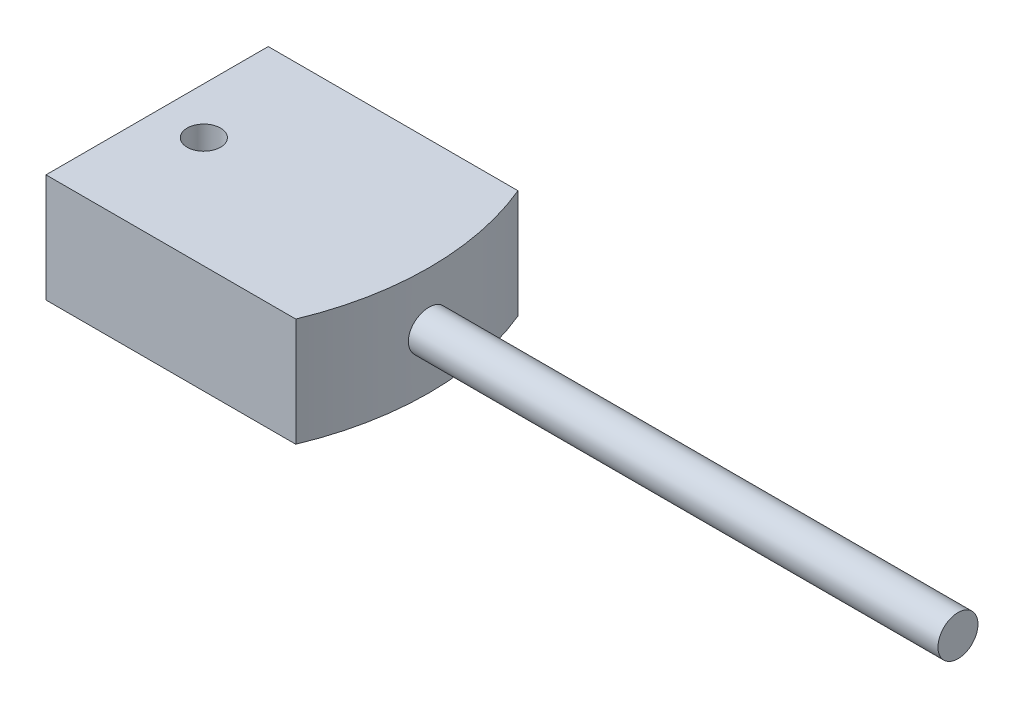
ISO-10303-21;
HEADER;
FILE_DESCRIPTION(('STEP AP214'),'2;1');
FILE_NAME('part.step','',(''),(''),'','','');
FILE_SCHEMA(('AUTOMOTIVE_DESIGN { 1 0 10303 214 1 1 1 1 }'));
ENDSEC;
DATA;
#1=APPLICATION_CONTEXT('core data for automotive mechanical design processes');
#2=APPLICATION_PROTOCOL_DEFINITION('international standard','automotive_design',2000,#1);
#3=PRODUCT_CONTEXT('',#1,'mechanical');
#4=PRODUCT('Part','Part','',(#3));
#5=PRODUCT_RELATED_PRODUCT_CATEGORY('part','',(#4));
#6=PRODUCT_DEFINITION_FORMATION('','',#4);
#7=PRODUCT_DEFINITION_CONTEXT('part definition',#1,'design');
#8=PRODUCT_DEFINITION('design','',#6,#7);
#9=PRODUCT_DEFINITION_SHAPE('','',#8);
#10=(LENGTH_UNIT() NAMED_UNIT(*) SI_UNIT(.MILLI.,.METRE.));
#11=(NAMED_UNIT(*) PLANE_ANGLE_UNIT() SI_UNIT($,.RADIAN.));
#12=(NAMED_UNIT(*) SI_UNIT($,.STERADIAN.) SOLID_ANGLE_UNIT());
#13=UNCERTAINTY_MEASURE_WITH_UNIT(LENGTH_MEASURE(1.E-05),#10,'distance_accuracy_value','');
#14=(GEOMETRIC_REPRESENTATION_CONTEXT(3) GLOBAL_UNCERTAINTY_ASSIGNED_CONTEXT((#13)) GLOBAL_UNIT_ASSIGNED_CONTEXT((#10,
#11,#12)) REPRESENTATION_CONTEXT('',''));
#15=CARTESIAN_POINT('',(0.,0.,0.));
#16=DIRECTION('',(0.,0.,1.));
#17=DIRECTION('',(1.,0.,0.));
#18=AXIS2_PLACEMENT_3D('',#15,#16,#17);
#19=CARTESIAN_POINT('',(0.,-4.1275,-8.4582));
#20=DIRECTION('',(-1.,0.,0.));
#21=DIRECTION('',(0.,0.,1.));
#22=AXIS2_PLACEMENT_3D('',#19,#20,#21);
#23=PLANE('',#22);
#24=DIRECTION('',(0.,1.,0.));
#25=VECTOR('',#24,1.);
#26=CARTESIAN_POINT('',(0.,-4.1275,8.4582));
#27=LINE('',#26,#25);
#28=CARTESIAN_POINT('',(0.,-4.1275,8.4582));
#29=VERTEX_POINT('',#28);
#30=CARTESIAN_POINT('',(0.,4.1275,8.4582));
#31=VERTEX_POINT('',#30);
#32=EDGE_CURVE('E77',#29,#31,#27,.T.);
#33=ORIENTED_EDGE('',*,*,#32,.T.);
#34=DIRECTION('',(0.,0.,1.));
#35=VECTOR('',#34,1.);
#36=CARTESIAN_POINT('',(0.,4.1275,-8.4582));
#37=LINE('',#36,#35);
#38=CARTESIAN_POINT('',(0.,4.1275,-8.4582));
#39=VERTEX_POINT('',#38);
#40=EDGE_CURVE('E80',#39,#31,#37,.T.);
#41=ORIENTED_EDGE('',*,*,#40,.F.);
#42=DIRECTION('',(0.,1.,0.));
#43=VECTOR('',#42,1.);
#44=CARTESIAN_POINT('',(0.,-4.1275,-8.4582));
#45=LINE('',#44,#43);
#46=CARTESIAN_POINT('',(0.,-4.1275,-8.4582));
#47=VERTEX_POINT('',#46);
#48=EDGE_CURVE('E46',#47,#39,#45,.T.);
#49=ORIENTED_EDGE('',*,*,#48,.F.);
#50=DIRECTION('',(0.,0.,1.));
#51=VECTOR('',#50,1.);
#52=CARTESIAN_POINT('',(0.,-4.1275,-8.4582));
#53=LINE('',#52,#51);
#54=EDGE_CURVE('E81',#47,#29,#53,.T.);
#55=ORIENTED_EDGE('',*,*,#54,.T.);
#56=EDGE_LOOP('',(#33,#41,#49,#55));
#57=FACE_BOUND('',#56,.T.);
#58=ADVANCED_FACE('F34',(#57),#23,.T.);
#59=CARTESIAN_POINT('',(0.,-4.1275,-8.4582));
#60=DIRECTION('',(0.,0.,-1.));
#61=DIRECTION('',(-1.,0.,0.));
#62=AXIS2_PLACEMENT_3D('',#59,#60,#61);
#63=PLANE('',#62);
#64=ORIENTED_EDGE('',*,*,#48,.T.);
#65=DIRECTION('',(-1.,0.,0.));
#66=VECTOR('',#65,1.);
#67=CARTESIAN_POINT('',(0.,4.1275,-8.4582));
#68=LINE('',#67,#66);
#69=CARTESIAN_POINT('',(19.0109115872841,4.1275,-8.4582));
#70=VERTEX_POINT('',#69);
#71=EDGE_CURVE('E98',#70,#39,#68,.T.);
#72=ORIENTED_EDGE('',*,*,#71,.F.);
#73=DIRECTION('',(0.,1.,0.));
#74=VECTOR('',#73,1.);
#75=CARTESIAN_POINT('',(19.0109115872841,-4.1275,-8.4582));
#76=LINE('',#75,#74);
#77=CARTESIAN_POINT('',(19.0109115872841,-4.1275,-8.4582));
#78=VERTEX_POINT('',#77);
#79=EDGE_CURVE('E60',#78,#70,#76,.T.);
#80=ORIENTED_EDGE('',*,*,#79,.F.);
#81=DIRECTION('',(-1.,0.,0.));
#82=VECTOR('',#81,1.);
#83=CARTESIAN_POINT('',(0.,-4.1275,-8.4582));
#84=LINE('',#83,#82);
#85=EDGE_CURVE('E86',#78,#47,#84,.T.);
#86=ORIENTED_EDGE('',*,*,#85,.T.);
#87=EDGE_LOOP('',(#64,#72,#80,#86));
#88=FACE_BOUND('',#87,.T.);
#89=ADVANCED_FACE('F123',(#88),#63,.T.);
#90=CARTESIAN_POINT('',(-1.30895685286196,-4.1275,0.));
#91=DIRECTION('',(0.,1.,0.));
#92=DIRECTION('',(0.,0.,1.));
#93=AXIS2_PLACEMENT_3D('',#90,#91,#92);
#94=CYLINDRICAL_SURFACE('',#93,22.009956852862);
#95=CARTESIAN_POINT('',(20.6481746689203,0.,-1.524));
#96=CARTESIAN_POINT('',(20.6481753736805,0.0854935892102639,-1.5239962456546));
#97=CARTESIAN_POINT('',(20.6486793646845,0.171046556361679,-1.51678176767352));
#98=CARTESIAN_POINT('',(20.6506410342152,0.33978875627285,-1.48810613556567));
#99=CARTESIAN_POINT('',(20.6520998141593,0.422975143227746,-1.46662852747539));
#100=CARTESIAN_POINT('',(20.6558050409871,0.584515593065406,-1.41004775284132));
#101=CARTESIAN_POINT('',(20.6580510630406,0.662872235525447,-1.37495193418645));
#102=CARTESIAN_POINT('',(20.6630771650274,0.812562410684095,-1.29214322807104));
#103=CARTESIAN_POINT('',(20.6658571250107,0.883897515349698,-1.24443317351575));
#104=CARTESIAN_POINT('',(20.6716435564557,1.01766903030627,-1.13765597046794));
#105=CARTESIAN_POINT('',(20.6746503839617,1.08009098892454,-1.07857073453173));
#106=CARTESIAN_POINT('',(20.6805484589532,1.19414043067057,-0.950758083120181));
#107=CARTESIAN_POINT('',(20.6834397015478,1.24576745739163,-0.882030260164154));
#108=CARTESIAN_POINT('',(20.6887840171801,1.33680722310857,-0.736800190016863));
#109=CARTESIAN_POINT('',(20.6912366535609,1.37620781837619,-0.660290312895642));
#110=CARTESIAN_POINT('',(20.6954236241466,1.4415985628889,-0.501721390017478));
#111=CARTESIAN_POINT('',(20.6971579674652,1.46758888228434,-0.419662414682756));
#112=CARTESIAN_POINT('',(20.6997104661758,1.50538069464529,-0.25246548531031));
#113=CARTESIAN_POINT('',(20.700530099766,1.51720508246092,-0.167332729157553));
#114=CARTESIAN_POINT('',(20.7011658156926,1.52640010577661,0.00371287052735174));
#115=CARTESIAN_POINT('',(20.7009819114929,1.52377093519153,0.0896257035782292));
#116=CARTESIAN_POINT('',(20.6996325025182,1.50415230959234,0.259637584880649));
#117=CARTESIAN_POINT('',(20.6984686809923,1.48718747941912,0.343739489944466));
#118=CARTESIAN_POINT('',(20.6952923647496,1.43941733990774,0.507899066894549));
#119=CARTESIAN_POINT('',(20.693279864109,1.40861193396078,0.587956710547069));
#120=CARTESIAN_POINT('',(20.6886298292125,1.33400733912662,0.741834073149012));
#121=CARTESIAN_POINT('',(20.6859917603912,1.29019702908102,0.815648383402729));
#122=CARTESIAN_POINT('',(20.6803873580139,1.19083432414051,0.954884707035817));
#123=CARTESIAN_POINT('',(20.6774210198963,1.13528176607007,1.02030660377015));
#124=CARTESIAN_POINT('',(20.6714864326967,1.01387250644691,1.14104481249369));
#125=CARTESIAN_POINT('',(20.6685181926693,0.947994424507888,1.19633962798204));
#126=CARTESIAN_POINT('',(20.6629206559878,0.807878943015965,1.29508821910094));
#127=CARTESIAN_POINT('',(20.6602913595041,0.733641539261805,1.33854198878035));
#128=CARTESIAN_POINT('',(20.6556687189152,0.578900658390888,1.41237367321296));
#129=CARTESIAN_POINT('',(20.6536754218344,0.498396718487353,1.44275062115257));
#130=CARTESIAN_POINT('',(20.6505511731524,0.333414513050013,1.48955121786321));
#131=CARTESIAN_POINT('',(20.6494202090839,0.248936304993113,1.50597506836215));
#132=CARTESIAN_POINT('',(20.6481505176205,0.0785912723707244,1.52437634977998));
#133=CARTESIAN_POINT('',(20.6480097359495,-0.00727230663581323,1.52638369000994));
#134=CARTESIAN_POINT('',(20.6487309162871,-0.178115685032471,1.51597317474905));
#135=CARTESIAN_POINT('',(20.6495928718729,-0.263095490079738,1.50355541165251));
#136=CARTESIAN_POINT('',(20.6522205204863,-0.429674102883208,1.46467205567639));
#137=CARTESIAN_POINT('',(20.6539853238351,-0.511276153719721,1.43822029114687));
#138=CARTESIAN_POINT('',(20.6582190500689,-0.668883081900941,1.3720338216664));
#139=CARTESIAN_POINT('',(20.6606879807869,-0.74488789696901,1.3322989689508));
#140=CARTESIAN_POINT('',(20.6660567333234,-0.889280092216766,1.24059803693368));
#141=CARTESIAN_POINT('',(20.6689572571348,-0.957654738688167,1.18861194885303));
#142=CARTESIAN_POINT('',(20.6748599196117,-1.08471729352135,1.07391329565856));
#143=CARTESIAN_POINT('',(20.6778620594912,-1.14340508611248,1.01120060236592));
#144=CARTESIAN_POINT('',(20.6836357110647,-1.24952934210155,0.876700042009762));
#145=CARTESIAN_POINT('',(20.6864068203195,-1.29694642803271,0.804896866019101));
#146=CARTESIAN_POINT('',(20.6914003865199,-1.37905057386904,0.654330342408364));
#147=CARTESIAN_POINT('',(20.6936228474705,-1.41373772670221,0.575567045602094));
#148=CARTESIAN_POINT('',(20.6972668045836,-1.46936378300248,0.413386790874226));
#149=CARTESIAN_POINT('',(20.698689010264,-1.49031486779623,0.329974027593819));
#150=CARTESIAN_POINT('',(20.7005750565518,-1.51791391332908,0.160804537967834));
#151=CARTESIAN_POINT('',(20.7010389091314,-1.52456205274676,0.0750478409172455));
#152=CARTESIAN_POINT('',(20.7009560171176,-1.5233646703227,-0.096183648258834));
#153=CARTESIAN_POINT('',(20.7004113843497,-1.51554943562541,-0.181658654842243));
#154=CARTESIAN_POINT('',(20.6983769353013,-1.48571005514619,-0.350079503515402));
#155=CARTESIAN_POINT('',(20.6968871174526,-1.46368588578929,-0.433025341408605));
#156=CARTESIAN_POINT('',(20.6931296609705,-1.40606093899377,-0.594037052822421));
#157=CARTESIAN_POINT('',(20.6908620372946,-1.37046042263443,-0.672103020151552));
#158=CARTESIAN_POINT('',(20.6858033044507,-1.28669725075935,-0.821154191023377));
#159=CARTESIAN_POINT('',(20.6830122073008,-1.23853488363291,-0.892139557067606));
#160=CARTESIAN_POINT('',(20.6772133332829,-1.13090236760736,-1.02516874941479));
#161=CARTESIAN_POINT('',(20.6742051398516,-1.07141010029435,-1.08719466134655));
#162=CARTESIAN_POINT('',(20.6683145502157,-0.942840549697687,-1.20040196369413));
#163=CARTESIAN_POINT('',(20.6654321848786,-0.873760931673062,-1.25158070487854));
#164=CARTESIAN_POINT('',(20.6601150704601,-0.727882779363204,-1.3416877822733));
#165=CARTESIAN_POINT('',(20.6576809640215,-0.651073403441762,-1.3805985866443));
#166=CARTESIAN_POINT('',(20.6535440549598,-0.492049698455752,-1.44492324168907));
#167=CARTESIAN_POINT('',(20.6518404008496,-0.409841792124297,-1.47035281563502));
#168=CARTESIAN_POINT('',(20.6498013529303,-0.272613369898831,-1.50042242153224));
#169=CARTESIAN_POINT('',(20.6491940950436,-0.218478671925974,-1.50925248739806));
#170=CARTESIAN_POINT('',(20.6483805275296,-0.109570779850628,-1.52104247467892));
#171=CARTESIAN_POINT('',(20.6481742172004,-0.0547975868658535,-1.52400240636836));
#172=CARTESIAN_POINT('',(20.6481746689203,0.,-1.524));
#173=B_SPLINE_CURVE_WITH_KNOTS('',3,(#95,#96,#97,#98,#99,#100,#101,#102,#103,#104,#105,#106,
#107,#108,#109,#110,#111,#112,#113,#114,#115,#116,#117,#118,#119,#120,#121,#122,#123,#124,#125,
#126,#127,#128,#129,#130,#131,#132,#133,#134,#135,#136,#137,#138,#139,#140,#141,#142,#143,#144,
#145,#146,#147,#148,#149,#150,#151,#152,#153,#154,#155,#156,#157,#158,#159,#160,#161,#162,#163,
#164,#165,#166,#167,#168,#169,#170,#171,#172),.UNSPECIFIED.,.T.,.F.,(4,2,2,2,2,2,2,2,2,2,2,2,2,
2,2,2,2,2,2,2,2,2,2,2,2,2,2,2,2,2,2,2,2,2,2,2,2,2,4),(0.,0.256280713533973,0.512857587561145,
0.769296214153128,1.02567729860199,1.28246946760835,1.53927249152147,1.79632977094009,
2.05338378872089,2.31002179524095,2.56665635860882,2.82285098622853,3.07904740214386,
3.33546353897185,3.59188323930742,3.84884108165735,4.10579905315058,4.36277601915292,
4.61974926982907,4.87618923478629,5.13262755722783,5.38881366714693,5.64500262704426,
5.9016129317153,6.15822630299534,6.41527772317069,6.6723272668439,6.92914854613614,
7.18596661708705,7.44224750451608,7.69852881715841,7.95480520164374,8.21107570316939,
8.46785172597465,8.72469038974225,8.9818944495592,9.23879786646862,9.40306268880083,
9.56732722362323),.UNSPECIFIED.);
#174=CARTESIAN_POINT('',(20.6481746689203,0.,-1.524));
#175=VERTEX_POINT('',#174);
#176=EDGE_CURVE('E11',#175,#175,#173,.T.);
#177=ORIENTED_EDGE('',*,*,#176,.F.);
#178=EDGE_LOOP('',(#177));
#179=FACE_BOUND('',#178,.T.);
#180=ORIENTED_EDGE('',*,*,#79,.T.);
#181=CARTESIAN_POINT('',(-1.30895685286196,4.1275,0.));
#182=DIRECTION('',(0.,1.,0.));
#183=DIRECTION('',(0.,0.,-1.));
#184=AXIS2_PLACEMENT_3D('',#181,#182,#183);
#185=CIRCLE('',#184,22.009956852862);
#186=CARTESIAN_POINT('',(19.0109115872841,4.1275,8.4582));
#187=VERTEX_POINT('',#186);
#188=EDGE_CURVE('E93',#187,#70,#185,.T.);
#189=ORIENTED_EDGE('',*,*,#188,.F.);
#190=DIRECTION('',(0.,1.,0.));
#191=VECTOR('',#190,1.);
#192=CARTESIAN_POINT('',(19.0109115872841,-4.1275,8.4582));
#193=LINE('',#192,#191);
#194=CARTESIAN_POINT('',(19.0109115872841,-4.1275,8.4582));
#195=VERTEX_POINT('',#194);
#196=EDGE_CURVE('E85',#195,#187,#193,.T.);
#197=ORIENTED_EDGE('',*,*,#196,.F.);
#198=CARTESIAN_POINT('',(-1.30895685286196,-4.1275,0.));
#199=DIRECTION('',(0.,1.,0.));
#200=DIRECTION('',(0.,0.,-1.));
#201=AXIS2_PLACEMENT_3D('',#198,#199,#200);
#202=CIRCLE('',#201,22.009956852862);
#203=EDGE_CURVE('E114',#195,#78,#202,.T.);
#204=ORIENTED_EDGE('',*,*,#203,.T.);
#205=EDGE_LOOP('',(#180,#189,#197,#204));
#206=FACE_BOUND('',#205,.T.);
#207=ADVANCED_FACE('F120',(#179,#206),#94,.T.);
#208=CARTESIAN_POINT('',(0.,-4.1275,8.4582));
#209=DIRECTION('',(0.,0.,1.));
#210=DIRECTION('',(1.,0.,0.));
#211=AXIS2_PLACEMENT_3D('',#208,#209,#210);
#212=PLANE('',#211);
#213=ORIENTED_EDGE('',*,*,#196,.T.);
#214=DIRECTION('',(1.,0.,0.));
#215=VECTOR('',#214,1.);
#216=CARTESIAN_POINT('',(0.,4.1275,8.4582));
#217=LINE('',#216,#215);
#218=EDGE_CURVE('E88',#31,#187,#217,.T.);
#219=ORIENTED_EDGE('',*,*,#218,.F.);
#220=ORIENTED_EDGE('',*,*,#32,.F.);
#221=DIRECTION('',(1.,0.,0.));
#222=VECTOR('',#221,1.);
#223=CARTESIAN_POINT('',(0.,-4.1275,8.4582));
#224=LINE('',#223,#222);
#225=EDGE_CURVE('E112',#29,#195,#224,.T.);
#226=ORIENTED_EDGE('',*,*,#225,.T.);
#227=EDGE_LOOP('',(#213,#219,#220,#226));
#228=FACE_BOUND('',#227,.T.);
#229=ADVANCED_FACE('F89',(#228),#212,.T.);
#230=CARTESIAN_POINT('',(-1.30895685286196,-4.1275,0.));
#231=DIRECTION('',(0.,-1.,0.));
#232=DIRECTION('',(0.,0.,-1.));
#233=AXIS2_PLACEMENT_3D('',#230,#231,#232);
#234=PLANE('',#233);
#235=CARTESIAN_POINT('',(3.556,-4.1275,0.));
#236=DIRECTION('',(0.,1.,0.));
#237=DIRECTION('',(0.,0.,1.));
#238=AXIS2_PLACEMENT_3D('',#235,#236,#237);
#239=CIRCLE('',#238,1.27);
#240=CARTESIAN_POINT('',(3.556,-4.1275,1.27));
#241=VERTEX_POINT('',#240);
#242=EDGE_CURVE('E108',#241,#241,#239,.T.);
#243=ORIENTED_EDGE('',*,*,#242,.T.);
#244=EDGE_LOOP('',(#243));
#245=FACE_BOUND('',#244,.T.);
#246=ORIENTED_EDGE('',*,*,#54,.F.);
#247=ORIENTED_EDGE('',*,*,#85,.F.);
#248=ORIENTED_EDGE('',*,*,#203,.F.);
#249=ORIENTED_EDGE('',*,*,#225,.F.);
#250=EDGE_LOOP('',(#246,#247,#248,#249));
#251=FACE_BOUND('',#250,.T.);
#252=ADVANCED_FACE('F125',(#245,#251),#234,.T.);
#253=CARTESIAN_POINT('',(3.556,-4.1275,0.));
#254=DIRECTION('',(0.,1.,0.));
#255=DIRECTION('',(0.,0.,1.));
#256=AXIS2_PLACEMENT_3D('',#253,#254,#255);
#257=CYLINDRICAL_SURFACE('',#256,1.27);
#258=ORIENTED_EDGE('',*,*,#242,.F.);
#259=EDGE_LOOP('',(#258));
#260=FACE_BOUND('',#259,.T.);
#261=CARTESIAN_POINT('',(3.556,4.1275,0.));
#262=DIRECTION('',(0.,1.,0.));
#263=DIRECTION('',(0.,0.,1.));
#264=AXIS2_PLACEMENT_3D('',#261,#262,#263);
#265=CIRCLE('',#264,1.27);
#266=CARTESIAN_POINT('',(3.556,4.1275,1.27));
#267=VERTEX_POINT('',#266);
#268=EDGE_CURVE('E99',#267,#267,#265,.T.);
#269=ORIENTED_EDGE('',*,*,#268,.T.);
#270=EDGE_LOOP('',(#269));
#271=FACE_BOUND('',#270,.T.);
#272=ADVANCED_FACE('F127',(#260,#271),#257,.F.);
#273=CARTESIAN_POINT('',(-1.30895685286196,4.1275,0.));
#274=DIRECTION('',(0.,-1.,0.));
#275=DIRECTION('',(0.,0.,-1.));
#276=AXIS2_PLACEMENT_3D('',#273,#274,#275);
#277=PLANE('',#276);
#278=ORIENTED_EDGE('',*,*,#40,.T.);
#279=ORIENTED_EDGE('',*,*,#218,.T.);
#280=ORIENTED_EDGE('',*,*,#188,.T.);
#281=ORIENTED_EDGE('',*,*,#71,.T.);
#282=EDGE_LOOP('',(#278,#279,#280,#281));
#283=FACE_BOUND('',#282,.T.);
#284=ORIENTED_EDGE('',*,*,#268,.F.);
#285=EDGE_LOOP('',(#284));
#286=FACE_BOUND('',#285,.T.);
#287=ADVANCED_FACE('F96',(#283,#286),#277,.F.);
#288=CARTESIAN_POINT('',(60.96,0.,0.));
#289=DIRECTION('',(1.,0.,0.));
#290=DIRECTION('',(0.,0.,-1.));
#291=AXIS2_PLACEMENT_3D('',#288,#289,#290);
#292=PLANE('',#291);
#293=CARTESIAN_POINT('',(60.96,0.,0.));
#294=DIRECTION('',(1.,0.,0.));
#295=DIRECTION('',(0.,0.,-1.));
#296=AXIS2_PLACEMENT_3D('',#293,#294,#295);
#297=CIRCLE('',#296,1.524);
#298=CARTESIAN_POINT('',(60.96,0.,-1.524));
#299=VERTEX_POINT('',#298);
#300=EDGE_CURVE('E102',#299,#299,#297,.T.);
#301=ORIENTED_EDGE('',*,*,#300,.T.);
#302=EDGE_LOOP('',(#301));
#303=FACE_BOUND('',#302,.T.);
#304=ADVANCED_FACE('F153',(#303),#292,.T.);
#305=CARTESIAN_POINT('',(21.73605,0.,0.));
#306=DIRECTION('',(1.,0.,0.));
#307=DIRECTION('',(0.,0.,-1.));
#308=AXIS2_PLACEMENT_3D('',#305,#306,#307);
#309=CYLINDRICAL_SURFACE('',#308,1.524);
#310=ORIENTED_EDGE('',*,*,#176,.T.);
#311=EDGE_LOOP('',(#310));
#312=FACE_BOUND('',#311,.T.);
#313=ORIENTED_EDGE('',*,*,#300,.F.);
#314=EDGE_LOOP('',(#313));
#315=FACE_BOUND('',#314,.T.);
#316=ADVANCED_FACE('F150',(#312,#315),#309,.T.);
#317=CLOSED_SHELL('',(#58,#89,#207,#229,#252,#272,#287,#304,#316));
#318=MANIFOLD_SOLID_BREP('B2',#317);
#319=ADVANCED_BREP_SHAPE_REPRESENTATION('',(#18,#318),#14);
#320=SHAPE_DEFINITION_REPRESENTATION(#9,#319);
ENDSEC;
END-ISO-10303-21;
